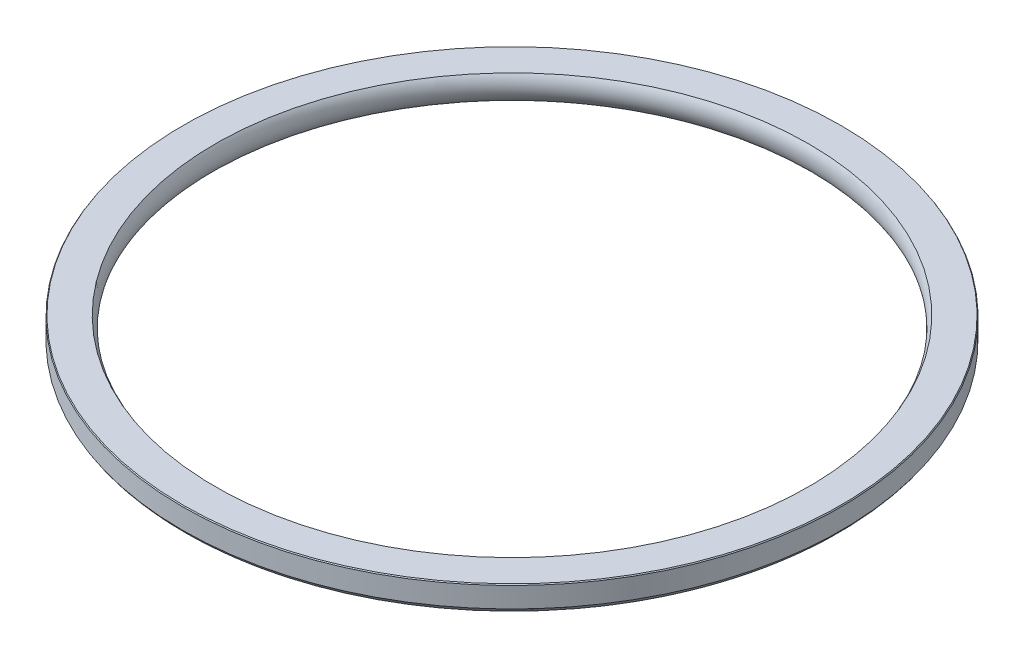
ISO-10303-21;
HEADER;
FILE_DESCRIPTION(('STEP AP214'),'2;1');
FILE_NAME('part.step','',(''),(''),'','','');
FILE_SCHEMA(('AUTOMOTIVE_DESIGN { 1 0 10303 214 1 1 1 1 }'));
ENDSEC;
DATA;
#1=APPLICATION_CONTEXT('core data for automotive mechanical design processes');
#2=APPLICATION_PROTOCOL_DEFINITION('international standard','automotive_design',2000,#1);
#3=PRODUCT_CONTEXT('',#1,'mechanical');
#4=PRODUCT('Part','Part','',(#3));
#5=PRODUCT_RELATED_PRODUCT_CATEGORY('part','',(#4));
#6=PRODUCT_DEFINITION_FORMATION('','',#4);
#7=PRODUCT_DEFINITION_CONTEXT('part definition',#1,'design');
#8=PRODUCT_DEFINITION('design','',#6,#7);
#9=PRODUCT_DEFINITION_SHAPE('','',#8);
#10=(LENGTH_UNIT() NAMED_UNIT(*) SI_UNIT(.MILLI.,.METRE.));
#11=(NAMED_UNIT(*) PLANE_ANGLE_UNIT() SI_UNIT($,.RADIAN.));
#12=(NAMED_UNIT(*) SI_UNIT($,.STERADIAN.) SOLID_ANGLE_UNIT());
#13=UNCERTAINTY_MEASURE_WITH_UNIT(LENGTH_MEASURE(1.E-05),#10,'distance_accuracy_value','');
#14=(GEOMETRIC_REPRESENTATION_CONTEXT(3) GLOBAL_UNCERTAINTY_ASSIGNED_CONTEXT((#13)) GLOBAL_UNIT_ASSIGNED_CONTEXT((#10,
#11,#12)) REPRESENTATION_CONTEXT('',''));
#15=CARTESIAN_POINT('',(0.,0.,0.));
#16=DIRECTION('',(0.,0.,1.));
#17=DIRECTION('',(1.,0.,0.));
#18=AXIS2_PLACEMENT_3D('',#15,#16,#17);
#19=CARTESIAN_POINT('',(0.,0.51,0.));
#20=DIRECTION('',(0.,1.,0.));
#21=DIRECTION('',(0.,0.,1.));
#22=AXIS2_PLACEMENT_3D('',#19,#20,#21);
#23=PLANE('',#22);
#24=CARTESIAN_POINT('',(0.,0.51,0.));
#25=DIRECTION('',(0.,-1.,0.));
#26=DIRECTION('',(0.,0.,-1.));
#27=AXIS2_PLACEMENT_3D('',#24,#25,#26);
#28=CIRCLE('',#27,13.5106166988476);
#29=CARTESIAN_POINT('',(0.,0.51,-13.5106166988476));
#30=VERTEX_POINT('',#29);
#31=EDGE_CURVE('E49',#30,#30,#28,.T.);
#32=ORIENTED_EDGE('',*,*,#31,.T.);
#33=EDGE_LOOP('',(#32));
#34=FACE_BOUND('',#33,.T.);
#35=CARTESIAN_POINT('',(0.,0.51,0.));
#36=DIRECTION('',(0.,-1.,0.));
#37=DIRECTION('',(0.,0.,-1.));
#38=AXIS2_PLACEMENT_3D('',#35,#36,#37);
#39=CIRCLE('',#38,14.9693833011524);
#40=CARTESIAN_POINT('',(0.,0.51,-14.9693833011524));
#41=VERTEX_POINT('',#40);
#42=EDGE_CURVE('E10',#41,#41,#39,.T.);
#43=ORIENTED_EDGE('',*,*,#42,.F.);
#44=EDGE_LOOP('',(#43));
#45=FACE_BOUND('',#44,.T.);
#46=ADVANCED_FACE('F35',(#34,#45),#23,.T.);
#47=CARTESIAN_POINT('',(0.,0.,0.));
#48=DIRECTION('',(0.,-1.,0.));
#49=DIRECTION('',(0.,0.,-1.));
#50=AXIS2_PLACEMENT_3D('',#47,#48,#49);
#51=TOROIDAL_SURFACE('',#50,14.24,0.89);
#52=CARTESIAN_POINT('',(0.,0.463141447076379,0.));
#53=DIRECTION('',(0.,-1.,0.));
#54=DIRECTION('',(0.,0.,-1.));
#55=AXIS2_PLACEMENT_3D('',#52,#53,#54);
#56=CIRCLE('',#55,15.);
#57=CARTESIAN_POINT('',(0.,0.463141447076379,-15.));
#58=VERTEX_POINT('',#57);
#59=EDGE_CURVE('E41',#58,#58,#56,.T.);
#60=ORIENTED_EDGE('',*,*,#59,.F.);
#61=EDGE_LOOP('',(#60));
#62=FACE_BOUND('',#61,.T.);
#63=ORIENTED_EDGE('',*,*,#42,.T.);
#64=EDGE_LOOP('',(#63));
#65=FACE_BOUND('',#64,.T.);
#66=ADVANCED_FACE('F62',(#62,#65),#51,.T.);
#67=CARTESIAN_POINT('',(0.,0.,0.));
#68=DIRECTION('',(0.,-1.,0.));
#69=DIRECTION('',(0.,0.,-1.));
#70=AXIS2_PLACEMENT_3D('',#67,#68,#69);
#71=CYLINDRICAL_SURFACE('',#70,15.);
#72=ORIENTED_EDGE('',*,*,#59,.T.);
#73=EDGE_LOOP('',(#72));
#74=FACE_BOUND('',#73,.T.);
#75=CARTESIAN_POINT('',(0.,-0.463141447076379,0.));
#76=DIRECTION('',(0.,-1.,0.));
#77=DIRECTION('',(0.,0.,-1.));
#78=AXIS2_PLACEMENT_3D('',#75,#76,#77);
#79=CIRCLE('',#78,15.);
#80=CARTESIAN_POINT('',(0.,-0.463141447076379,-15.));
#81=VERTEX_POINT('',#80);
#82=EDGE_CURVE('E45',#81,#81,#79,.T.);
#83=ORIENTED_EDGE('',*,*,#82,.F.);
#84=EDGE_LOOP('',(#83));
#85=FACE_BOUND('',#84,.T.);
#86=ADVANCED_FACE('F60',(#74,#85),#71,.T.);
#87=ORIENTED_EDGE('',*,*,#31,.F.);
#88=EDGE_LOOP('',(#87));
#89=FACE_BOUND('',#88,.T.);
#90=ORIENTED_EDGE('',*,*,#82,.T.);
#91=EDGE_LOOP('',(#90));
#92=FACE_BOUND('',#91,.T.);
#93=ADVANCED_FACE('F57',(#89,#92),#51,.T.);
#94=CLOSED_SHELL('',(#46,#66,#86,#93));
#95=MANIFOLD_SOLID_BREP('B2',#94);
#96=ADVANCED_BREP_SHAPE_REPRESENTATION('',(#18,#95),#14);
#97=SHAPE_DEFINITION_REPRESENTATION(#9,#96);
ENDSEC;
END-ISO-10303-21;
